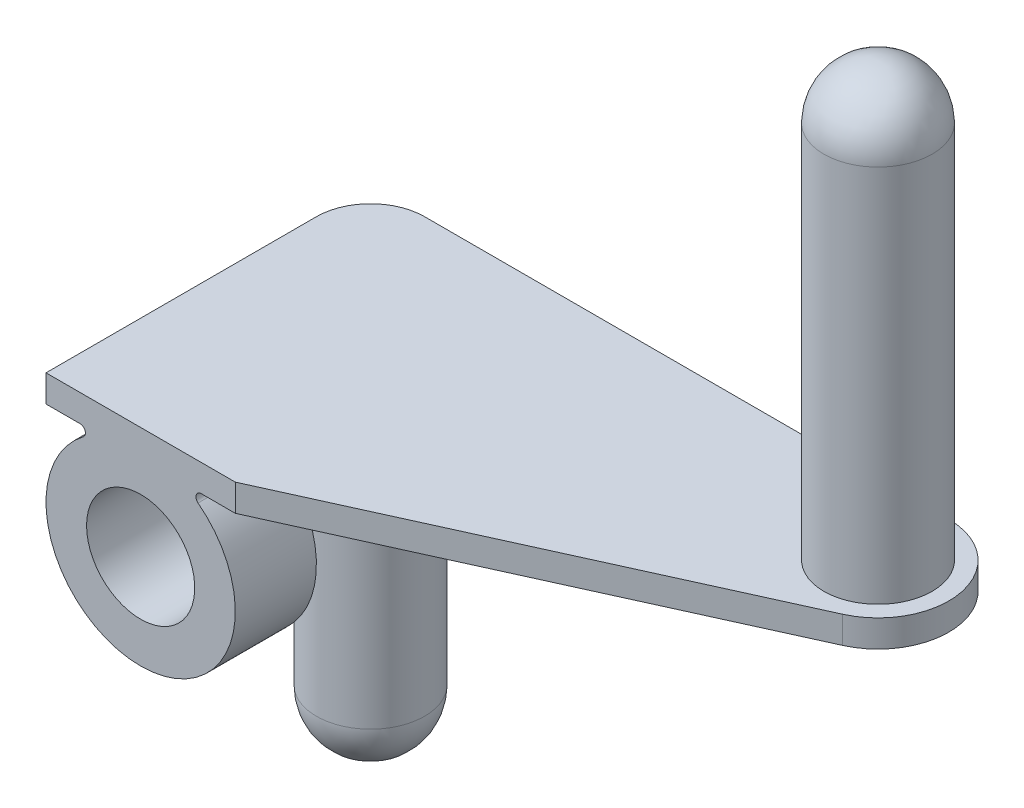
ISO-10303-21;
HEADER;
FILE_DESCRIPTION(('STEP AP214'),'2;1');
FILE_NAME('part.step','',(''),(''),'','','');
FILE_SCHEMA(('AUTOMOTIVE_DESIGN { 1 0 10303 214 1 1 1 1 }'));
ENDSEC;
DATA;
#1=APPLICATION_CONTEXT('core data for automotive mechanical design processes');
#2=APPLICATION_PROTOCOL_DEFINITION('international standard','automotive_design',2000,#1);
#3=PRODUCT_CONTEXT('',#1,'mechanical');
#4=PRODUCT('Part','Part','',(#3));
#5=PRODUCT_RELATED_PRODUCT_CATEGORY('part','',(#4));
#6=PRODUCT_DEFINITION_FORMATION('','',#4);
#7=PRODUCT_DEFINITION_CONTEXT('part definition',#1,'design');
#8=PRODUCT_DEFINITION('design','',#6,#7);
#9=PRODUCT_DEFINITION_SHAPE('','',#8);
#10=(LENGTH_UNIT() NAMED_UNIT(*) SI_UNIT(.MILLI.,.METRE.));
#11=(NAMED_UNIT(*) PLANE_ANGLE_UNIT() SI_UNIT($,.RADIAN.));
#12=(NAMED_UNIT(*) SI_UNIT($,.STERADIAN.) SOLID_ANGLE_UNIT());
#13=UNCERTAINTY_MEASURE_WITH_UNIT(LENGTH_MEASURE(1.E-05),#10,'distance_accuracy_value','');
#14=(GEOMETRIC_REPRESENTATION_CONTEXT(3) GLOBAL_UNCERTAINTY_ASSIGNED_CONTEXT((#13)) GLOBAL_UNIT_ASSIGNED_CONTEXT((#10,
#11,#12)) REPRESENTATION_CONTEXT('',''));
#15=CARTESIAN_POINT('',(0.,0.,0.));
#16=DIRECTION('',(0.,0.,1.));
#17=DIRECTION('',(1.,0.,0.));
#18=AXIS2_PLACEMENT_3D('',#15,#16,#17);
#19=CARTESIAN_POINT('',(-38.3909419454001,-16.,20.));
#20=DIRECTION('',(0.,1.,0.));
#21=DIRECTION('',(0.,0.,-1.));
#22=AXIS2_PLACEMENT_3D('',#19,#20,#21);
#23=CYLINDRICAL_SURFACE('',#22,2.);
#24=CARTESIAN_POINT('',(-38.3909419454001,-1.,20.));
#25=DIRECTION('',(0.,1.,0.));
#26=DIRECTION('',(0.,0.,1.));
#27=AXIS2_PLACEMENT_3D('',#24,#25,#26);
#28=CIRCLE('',#27,2.);
#29=CARTESIAN_POINT('',(-38.3909419454001,-1.,18.));
#30=VERTEX_POINT('',#29);
#31=CARTESIAN_POINT('',(-40.3909419454001,-1.,20.));
#32=VERTEX_POINT('',#31);
#33=EDGE_CURVE('E184',#30,#32,#28,.F.);
#34=ORIENTED_EDGE('',*,*,#33,.T.);
#35=DIRECTION('',(0.,1.,0.));
#36=VECTOR('',#35,1.);
#37=CARTESIAN_POINT('',(-40.3909419454001,-1.,20.));
#38=LINE('',#37,#36);
#39=CARTESIAN_POINT('',(-40.3909419454001,0.,20.));
#40=VERTEX_POINT('',#39);
#41=EDGE_CURVE('E249',#32,#40,#38,.T.);
#42=ORIENTED_EDGE('',*,*,#41,.T.);
#43=CARTESIAN_POINT('',(-38.3909419454001,0.,20.));
#44=DIRECTION('',(0.,-1.,0.));
#45=DIRECTION('',(0.,0.,-1.));
#46=AXIS2_PLACEMENT_3D('',#43,#44,#45);
#47=CIRCLE('',#46,2.);
#48=CARTESIAN_POINT('',(-38.3909419454001,0.,18.));
#49=VERTEX_POINT('',#48);
#50=EDGE_CURVE('E186',#40,#49,#47,.T.);
#51=ORIENTED_EDGE('',*,*,#50,.T.);
#52=DIRECTION('',(0.,1.,0.));
#53=VECTOR('',#52,1.);
#54=CARTESIAN_POINT('',(-38.3909419454001,-1.,18.));
#55=LINE('',#54,#53);
#56=EDGE_CURVE('E171',#30,#49,#55,.T.);
#57=ORIENTED_EDGE('',*,*,#56,.F.);
#58=EDGE_LOOP('',(#34,#42,#51,#57));
#59=FACE_BOUND('',#58,.T.);
#60=CARTESIAN_POINT('',(-38.3909419454001,-14.,20.));
#61=DIRECTION('',(0.,-1.,0.));
#62=DIRECTION('',(0.,0.,-1.));
#63=AXIS2_PLACEMENT_3D('',#60,#61,#62);
#64=CIRCLE('',#63,2.);
#65=CARTESIAN_POINT('',(-38.3909419454001,-14.,18.));
#66=VERTEX_POINT('',#65);
#67=EDGE_CURVE('E194',#66,#66,#64,.T.);
#68=ORIENTED_EDGE('',*,*,#67,.F.);
#69=EDGE_LOOP('',(#68));
#70=FACE_BOUND('',#69,.T.);
#71=ADVANCED_FACE('F89',(#59,#70),#23,.T.);
#72=CARTESIAN_POINT('',(-38.3909419454001,0.,20.));
#73=DIRECTION('',(0.,1.,0.));
#74=DIRECTION('',(0.,0.,-1.));
#75=AXIS2_PLACEMENT_3D('',#72,#73,#74);
#76=PLANE('',#75);
#77=CARTESIAN_POINT('',(-19.0077705365883,0.,20.6168285911882));
#78=DIRECTION('',(0.,-1.,0.));
#79=DIRECTION('',(0.,0.,-1.));
#80=AXIS2_PLACEMENT_3D('',#77,#78,#79);
#81=CIRCLE('',#80,2.);
#82=CARTESIAN_POINT('',(-19.0077705365883,0.,18.6168285911882));
#83=VERTEX_POINT('',#82);
#84=EDGE_CURVE('E240',#83,#83,#81,.T.);
#85=ORIENTED_EDGE('',*,*,#84,.T.);
#86=EDGE_LOOP('',(#85));
#87=FACE_BOUND('',#86,.T.);
#88=ORIENTED_EDGE('',*,*,#50,.F.);
#89=DIRECTION('',(0.,0.,-1.));
#90=VECTOR('',#89,1.);
#91=CARTESIAN_POINT('',(-40.3909419454001,0.,20.));
#92=LINE('',#91,#90);
#93=CARTESIAN_POINT('',(-40.3909419454001,0.,30.));
#94=VERTEX_POINT('',#93);
#95=EDGE_CURVE('E178',#94,#40,#92,.T.);
#96=ORIENTED_EDGE('',*,*,#95,.F.);
#97=DIRECTION('',(-1.,0.,0.));
#98=VECTOR('',#97,1.);
#99=CARTESIAN_POINT('',(-40.3909419454001,0.,30.));
#100=LINE('',#99,#98);
#101=CARTESIAN_POINT('',(-33.3909419454001,0.,30.));
#102=VERTEX_POINT('',#101);
#103=EDGE_CURVE('E246',#102,#94,#100,.T.);
#104=ORIENTED_EDGE('',*,*,#103,.F.);
#105=DIRECTION('',(-0.91101143688837,0.,0.412381088143707));
#106=VECTOR('',#105,1.);
#107=CARTESIAN_POINT('',(-33.3909419454001,0.,30.));
#108=LINE('',#107,#106);
#109=CARTESIAN_POINT('',(-17.9286399146686,0.,23.0007893661372));
#110=VERTEX_POINT('',#109);
#111=EDGE_CURVE('E243',#110,#102,#108,.T.);
#112=ORIENTED_EDGE('',*,*,#111,.F.);
#113=CARTESIAN_POINT('',(-19.0077705365883,0.,20.6168285911882));
#114=DIRECTION('',(0.,-1.,0.));
#115=DIRECTION('',(0.,0.,1.));
#116=AXIS2_PLACEMENT_3D('',#113,#114,#115);
#117=CIRCLE('',#116,2.61682859118822);
#118=CARTESIAN_POINT('',(-19.0077705365883,0.,18.));
#119=VERTEX_POINT('',#118);
#120=EDGE_CURVE('E239',#119,#110,#117,.T.);
#121=ORIENTED_EDGE('',*,*,#120,.F.);
#122=DIRECTION('',(1.,0.,0.));
#123=VECTOR('',#122,1.);
#124=CARTESIAN_POINT('',(-19.0077705365883,0.,18.));
#125=LINE('',#124,#123);
#126=EDGE_CURVE('E237',#49,#119,#125,.T.);
#127=ORIENTED_EDGE('',*,*,#126,.F.);
#128=EDGE_LOOP('',(#88,#96,#104,#112,#121,#127));
#129=FACE_BOUND('',#128,.T.);
#130=ADVANCED_FACE('F262',(#87,#129),#76,.T.);
#131=CARTESIAN_POINT('',(-38.3909419454001,-14.,20.));
#132=DIRECTION('',(0.,1.,0.));
#133=DIRECTION('',(0.,0.,-1.));
#134=AXIS2_PLACEMENT_3D('',#131,#132,#133);
#135=SPHERICAL_SURFACE('',#134,2.);
#136=ORIENTED_EDGE('',*,*,#67,.T.);
#137=EDGE_LOOP('',(#136));
#138=FACE_BOUND('',#137,.T.);
#139=ADVANCED_FACE('F305',(#138),#135,.T.);
#140=CARTESIAN_POINT('',(-40.3909419454001,-1.,20.));
#141=DIRECTION('',(-1.,0.,0.));
#142=DIRECTION('',(0.,0.,-1.));
#143=AXIS2_PLACEMENT_3D('',#140,#141,#142);
#144=PLANE('',#143);
#145=ORIENTED_EDGE('',*,*,#95,.T.);
#146=ORIENTED_EDGE('',*,*,#41,.F.);
#147=DIRECTION('',(0.,0.,-1.));
#148=VECTOR('',#147,1.);
#149=CARTESIAN_POINT('',(-40.3909419454001,-1.,20.));
#150=LINE('',#149,#148);
#151=CARTESIAN_POINT('',(-40.3909419454001,-1.,30.));
#152=VERTEX_POINT('',#151);
#153=EDGE_CURVE('E187',#152,#32,#150,.T.);
#154=ORIENTED_EDGE('',*,*,#153,.F.);
#155=DIRECTION('',(0.,1.,0.));
#156=VECTOR('',#155,1.);
#157=CARTESIAN_POINT('',(-40.3909419454001,-1.,30.));
#158=LINE('',#157,#156);
#159=EDGE_CURVE('E228',#152,#94,#158,.T.);
#160=ORIENTED_EDGE('',*,*,#159,.T.);
#161=EDGE_LOOP('',(#145,#146,#154,#160));
#162=FACE_BOUND('',#161,.T.);
#163=ADVANCED_FACE('F312',(#162),#144,.T.);
#164=CARTESIAN_POINT('',(-40.3909419454001,-1.,30.));
#165=DIRECTION('',(0.,0.,1.));
#166=DIRECTION('',(-1.,0.,0.));
#167=AXIS2_PLACEMENT_3D('',#164,#165,#166);
#168=PLANE('',#167);
#169=CARTESIAN_POINT('',(-36.8909419454001,-4.14203978385195,30.));
#170=DIRECTION('',(0.,0.,-1.));
#171=DIRECTION('',(-1.,0.,0.));
#172=AXIS2_PLACEMENT_3D('',#169,#170,#171);
#173=CIRCLE('',#172,2.);
#174=CARTESIAN_POINT('',(-38.8909419454001,-4.14203978385195,30.));
#175=VERTEX_POINT('',#174);
#176=EDGE_CURVE('E276',#175,#175,#173,.T.);
#177=ORIENTED_EDGE('',*,*,#176,.T.);
#178=EDGE_LOOP('',(#177));
#179=FACE_BOUND('',#178,.T.);
#180=DIRECTION('',(-1.,0.,0.));
#181=VECTOR('',#180,1.);
#182=CARTESIAN_POINT('',(-40.3909419454001,-1.,30.));
#183=LINE('',#182,#181);
#184=CARTESIAN_POINT('',(-33.3909419454001,-1.,30.));
#185=VERTEX_POINT('',#184);
#186=CARTESIAN_POINT('',(-34.6471946534279,-1.,30.));
#187=VERTEX_POINT('',#186);
#188=EDGE_CURVE('E229',#185,#187,#183,.T.);
#189=ORIENTED_EDGE('',*,*,#188,.F.);
#190=DIRECTION('',(0.,1.,0.));
#191=VECTOR('',#190,1.);
#192=CARTESIAN_POINT('',(-33.3909419454001,-1.,30.));
#193=LINE('',#192,#191);
#194=EDGE_CURVE('E252',#185,#102,#193,.T.);
#195=ORIENTED_EDGE('',*,*,#194,.T.);
#196=ORIENTED_EDGE('',*,*,#103,.T.);
#197=ORIENTED_EDGE('',*,*,#159,.F.);
#198=CARTESIAN_POINT('',(-39.1346892373723,-1.,30.));
#199=VERTEX_POINT('',#198);
#200=EDGE_CURVE('E224',#199,#152,#183,.T.);
#201=ORIENTED_EDGE('',*,*,#200,.F.);
#202=CARTESIAN_POINT('',(-39.1346892373723,-1.2,30.));
#203=DIRECTION('',(0.,0.,-1.));
#204=DIRECTION('',(-1.,0.,0.));
#205=AXIS2_PLACEMENT_3D('',#202,#203,#204);
#206=CIRCLE('',#205,0.2);
#207=CARTESIAN_POINT('',(-39.0134055999684,-1.35902917750551,30.));
#208=VERTEX_POINT('',#207);
#209=EDGE_CURVE('E98',#208,#199,#206,.F.);
#210=ORIENTED_EDGE('',*,*,#209,.F.);
#211=CARTESIAN_POINT('',(-36.8909419454001,-4.14203978385195,30.));
#212=DIRECTION('',(0.,0.,-1.));
#213=DIRECTION('',(-1.,0.,0.));
#214=AXIS2_PLACEMENT_3D('',#211,#212,#213);
#215=CIRCLE('',#214,3.5);
#216=CARTESIAN_POINT('',(-34.7684782908318,-1.35902917750551,30.));
#217=VERTEX_POINT('',#216);
#218=EDGE_CURVE('E273',#217,#208,#215,.T.);
#219=ORIENTED_EDGE('',*,*,#218,.F.);
#220=CARTESIAN_POINT('',(-34.6471946534279,-1.2,30.));
#221=DIRECTION('',(0.,0.,-1.));
#222=DIRECTION('',(-1.,0.,0.));
#223=AXIS2_PLACEMENT_3D('',#220,#221,#222);
#224=CIRCLE('',#223,0.2);
#225=EDGE_CURVE('E213',#187,#217,#224,.F.);
#226=ORIENTED_EDGE('',*,*,#225,.F.);
#227=EDGE_LOOP('',(#189,#195,#196,#197,#201,#210,#219,#226));
#228=FACE_BOUND('',#227,.T.);
#229=ADVANCED_FACE('F226',(#179,#228),#168,.T.);
#230=CARTESIAN_POINT('',(-33.3909419454001,-1.,30.));
#231=DIRECTION('',(0.412381088143707,0.,0.91101143688837));
#232=DIRECTION('',(-0.91101143688837,0.,0.412381088143707));
#233=AXIS2_PLACEMENT_3D('',#230,#231,#232);
#234=PLANE('',#233);
#235=ORIENTED_EDGE('',*,*,#111,.T.);
#236=ORIENTED_EDGE('',*,*,#194,.F.);
#237=DIRECTION('',(-0.91101143688837,0.,0.412381088143707));
#238=VECTOR('',#237,1.);
#239=CARTESIAN_POINT('',(-33.3909419454001,-1.,30.));
#240=LINE('',#239,#238);
#241=CARTESIAN_POINT('',(-17.9286399146686,-1.,23.0007893661372));
#242=VERTEX_POINT('',#241);
#243=EDGE_CURVE('E230',#242,#185,#240,.T.);
#244=ORIENTED_EDGE('',*,*,#243,.F.);
#245=DIRECTION('',(0.,1.,0.));
#246=VECTOR('',#245,1.);
#247=CARTESIAN_POINT('',(-17.9286399146686,-1.,23.0007893661372));
#248=LINE('',#247,#246);
#249=EDGE_CURVE('E254',#242,#110,#248,.T.);
#250=ORIENTED_EDGE('',*,*,#249,.T.);
#251=EDGE_LOOP('',(#235,#236,#244,#250));
#252=FACE_BOUND('',#251,.T.);
#253=ADVANCED_FACE('F267',(#252),#234,.T.);
#254=CARTESIAN_POINT('',(-19.0077705365883,-1.,20.6168285911882));
#255=DIRECTION('',(0.,1.,0.));
#256=DIRECTION('',(0.,0.,-1.));
#257=AXIS2_PLACEMENT_3D('',#254,#255,#256);
#258=CYLINDRICAL_SURFACE('',#257,2.61682859118822);
#259=ORIENTED_EDGE('',*,*,#120,.T.);
#260=ORIENTED_EDGE('',*,*,#249,.F.);
#261=CARTESIAN_POINT('',(-19.0077705365883,-1.,20.6168285911882));
#262=DIRECTION('',(0.,-1.,0.));
#263=DIRECTION('',(0.,0.,1.));
#264=AXIS2_PLACEMENT_3D('',#261,#262,#263);
#265=CIRCLE('',#264,2.61682859118822);
#266=CARTESIAN_POINT('',(-19.0077705365883,-1.,18.));
#267=VERTEX_POINT('',#266);
#268=EDGE_CURVE('E177',#267,#242,#265,.T.);
#269=ORIENTED_EDGE('',*,*,#268,.F.);
#270=DIRECTION('',(0.,1.,0.));
#271=VECTOR('',#270,1.);
#272=CARTESIAN_POINT('',(-19.0077705365883,-1.,18.));
#273=LINE('',#272,#271);
#274=EDGE_CURVE('E173',#267,#119,#273,.T.);
#275=ORIENTED_EDGE('',*,*,#274,.T.);
#276=EDGE_LOOP('',(#259,#260,#269,#275));
#277=FACE_BOUND('',#276,.T.);
#278=ADVANCED_FACE('F257',(#277),#258,.T.);
#279=CARTESIAN_POINT('',(-19.0077705365883,-1.,18.));
#280=DIRECTION('',(0.,0.,-1.));
#281=DIRECTION('',(1.,0.,0.));
#282=AXIS2_PLACEMENT_3D('',#279,#280,#281);
#283=PLANE('',#282);
#284=ORIENTED_EDGE('',*,*,#126,.T.);
#285=ORIENTED_EDGE('',*,*,#274,.F.);
#286=DIRECTION('',(1.,0.,0.));
#287=VECTOR('',#286,1.);
#288=CARTESIAN_POINT('',(-19.0077705365883,-1.,18.));
#289=LINE('',#288,#287);
#290=EDGE_CURVE('E167',#30,#267,#289,.T.);
#291=ORIENTED_EDGE('',*,*,#290,.F.);
#292=ORIENTED_EDGE('',*,*,#56,.T.);
#293=EDGE_LOOP('',(#284,#285,#291,#292));
#294=FACE_BOUND('',#293,.T.);
#295=ADVANCED_FACE('F170',(#294),#283,.T.);
#296=CARTESIAN_POINT('',(-38.3909419454001,-1.,20.));
#297=DIRECTION('',(0.,-1.,0.));
#298=DIRECTION('',(0.,0.,1.));
#299=AXIS2_PLACEMENT_3D('',#296,#297,#298);
#300=PLANE('',#299);
#301=DIRECTION('',(1.,0.,0.));
#302=VECTOR('',#301,1.);
#303=CARTESIAN_POINT('',(-38.3909419454001,-1.,27.));
#304=LINE('',#303,#302);
#305=CARTESIAN_POINT('',(-39.1346892373723,-1.,27.));
#306=VERTEX_POINT('',#305);
#307=CARTESIAN_POINT('',(-34.6471946534279,-1.,27.));
#308=VERTEX_POINT('',#307);
#309=EDGE_CURVE('E197',#306,#308,#304,.T.);
#310=ORIENTED_EDGE('',*,*,#309,.F.);
#311=DIRECTION('',(0.,0.,-1.));
#312=VECTOR('',#311,1.);
#313=CARTESIAN_POINT('',(-39.1346892373723,-1.,27.));
#314=LINE('',#313,#312);
#315=EDGE_CURVE('E208',#199,#306,#314,.T.);
#316=ORIENTED_EDGE('',*,*,#315,.F.);
#317=ORIENTED_EDGE('',*,*,#200,.T.);
#318=ORIENTED_EDGE('',*,*,#153,.T.);
#319=ORIENTED_EDGE('',*,*,#33,.F.);
#320=ORIENTED_EDGE('',*,*,#290,.T.);
#321=ORIENTED_EDGE('',*,*,#268,.T.);
#322=ORIENTED_EDGE('',*,*,#243,.T.);
#323=ORIENTED_EDGE('',*,*,#188,.T.);
#324=DIRECTION('',(0.,0.,-1.));
#325=VECTOR('',#324,1.);
#326=CARTESIAN_POINT('',(-34.6471946534279,-1.,30.));
#327=LINE('',#326,#325);
#328=EDGE_CURVE('E210',#308,#187,#327,.F.);
#329=ORIENTED_EDGE('',*,*,#328,.F.);
#330=EDGE_LOOP('',(#310,#316,#317,#318,#319,#320,#321,#322,#323,#329));
#331=FACE_BOUND('',#330,.T.);
#332=ADVANCED_FACE('F190',(#331),#300,.T.);
#333=CARTESIAN_POINT('',(-19.0077705365883,16.,20.6168285911882));
#334=DIRECTION('',(0.,-1.,0.));
#335=DIRECTION('',(0.,0.,1.));
#336=AXIS2_PLACEMENT_3D('',#333,#334,#335);
#337=CYLINDRICAL_SURFACE('',#336,2.);
#338=CARTESIAN_POINT('',(-19.0077705365883,14.,20.6168285911882));
#339=DIRECTION('',(0.,1.,0.));
#340=DIRECTION('',(0.,0.,1.));
#341=AXIS2_PLACEMENT_3D('',#338,#339,#340);
#342=CIRCLE('',#341,2.);
#343=CARTESIAN_POINT('',(-19.0077705365883,14.,22.6168285911882));
#344=VERTEX_POINT('',#343);
#345=EDGE_CURVE('E193',#344,#344,#342,.T.);
#346=ORIENTED_EDGE('',*,*,#345,.F.);
#347=EDGE_LOOP('',(#346));
#348=FACE_BOUND('',#347,.T.);
#349=ORIENTED_EDGE('',*,*,#84,.F.);
#350=EDGE_LOOP('',(#349));
#351=FACE_BOUND('',#350,.T.);
#352=ADVANCED_FACE('F315',(#348,#351),#337,.T.);
#353=CARTESIAN_POINT('',(-19.0077705365883,14.,20.6168285911882));
#354=DIRECTION('',(0.,1.,0.));
#355=DIRECTION('',(0.,0.,-1.));
#356=AXIS2_PLACEMENT_3D('',#353,#354,#355);
#357=SPHERICAL_SURFACE('',#356,2.);
#358=ORIENTED_EDGE('',*,*,#345,.T.);
#359=EDGE_LOOP('',(#358));
#360=FACE_BOUND('',#359,.T.);
#361=ADVANCED_FACE('F288',(#360),#357,.T.);
#362=CARTESIAN_POINT('',(-36.8909419454001,-4.14203978385195,27.));
#363=DIRECTION('',(0.,0.,1.));
#364=DIRECTION('',(-1.,0.,0.));
#365=AXIS2_PLACEMENT_3D('',#362,#363,#364);
#366=PLANE('',#365);
#367=CARTESIAN_POINT('',(-36.8909419454001,-4.14203978385195,27.));
#368=DIRECTION('',(0.,0.,-1.));
#369=DIRECTION('',(-1.,0.,0.));
#370=AXIS2_PLACEMENT_3D('',#367,#368,#369);
#371=CIRCLE('',#370,2.);
#372=CARTESIAN_POINT('',(-38.8909419454001,-4.14203978385195,27.));
#373=VERTEX_POINT('',#372);
#374=EDGE_CURVE('E93',#373,#373,#371,.T.);
#375=ORIENTED_EDGE('',*,*,#374,.F.);
#376=EDGE_LOOP('',(#375));
#377=FACE_BOUND('',#376,.T.);
#378=ORIENTED_EDGE('',*,*,#309,.T.);
#379=CARTESIAN_POINT('',(-34.6471946534279,-1.2,27.));
#380=DIRECTION('',(0.,0.,-1.));
#381=DIRECTION('',(-1.,0.,0.));
#382=AXIS2_PLACEMENT_3D('',#379,#380,#381);
#383=CIRCLE('',#382,0.2);
#384=CARTESIAN_POINT('',(-34.7684782908318,-1.35902917750551,27.));
#385=VERTEX_POINT('',#384);
#386=EDGE_CURVE('E105',#385,#308,#383,.T.);
#387=ORIENTED_EDGE('',*,*,#386,.F.);
#388=CARTESIAN_POINT('',(-36.8909419454001,-4.14203978385195,27.));
#389=DIRECTION('',(0.,0.,-1.));
#390=DIRECTION('',(-1.,0.,0.));
#391=AXIS2_PLACEMENT_3D('',#388,#389,#390);
#392=CIRCLE('',#391,3.5);
#393=CARTESIAN_POINT('',(-39.0134055999684,-1.35902917750551,27.));
#394=VERTEX_POINT('',#393);
#395=EDGE_CURVE('E272',#385,#394,#392,.T.);
#396=ORIENTED_EDGE('',*,*,#395,.T.);
#397=CARTESIAN_POINT('',(-39.1346892373723,-1.2,27.));
#398=DIRECTION('',(0.,0.,-1.));
#399=DIRECTION('',(-1.,0.,0.));
#400=AXIS2_PLACEMENT_3D('',#397,#398,#399);
#401=CIRCLE('',#400,0.2);
#402=EDGE_CURVE('E12',#306,#394,#401,.T.);
#403=ORIENTED_EDGE('',*,*,#402,.F.);
#404=EDGE_LOOP('',(#378,#387,#396,#403));
#405=FACE_BOUND('',#404,.T.);
#406=ADVANCED_FACE('F285',(#377,#405),#366,.F.);
#407=CARTESIAN_POINT('',(-36.8909419454001,-4.14203978385195,27.));
#408=DIRECTION('',(0.,0.,1.));
#409=DIRECTION('',(-1.,0.,0.));
#410=AXIS2_PLACEMENT_3D('',#407,#408,#409);
#411=CYLINDRICAL_SURFACE('',#410,3.5);
#412=ORIENTED_EDGE('',*,*,#218,.T.);
#413=DIRECTION('',(0.,0.,1.));
#414=VECTOR('',#413,1.);
#415=CARTESIAN_POINT('',(-39.0134055999684,-1.35902917750551,27.));
#416=LINE('',#415,#414);
#417=EDGE_CURVE('E204',#394,#208,#416,.T.);
#418=ORIENTED_EDGE('',*,*,#417,.F.);
#419=ORIENTED_EDGE('',*,*,#395,.F.);
#420=DIRECTION('',(0.,0.,1.));
#421=VECTOR('',#420,1.);
#422=CARTESIAN_POINT('',(-34.7684782908318,-1.35902917750551,27.));
#423=LINE('',#422,#421);
#424=EDGE_CURVE('E206',#217,#385,#423,.F.);
#425=ORIENTED_EDGE('',*,*,#424,.F.);
#426=EDGE_LOOP('',(#412,#418,#419,#425));
#427=FACE_BOUND('',#426,.T.);
#428=ADVANCED_FACE('F287',(#427),#411,.T.);
#429=CARTESIAN_POINT('',(-34.6471946534279,-1.2,27.));
#430=DIRECTION('',(0.,0.,1.));
#431=DIRECTION('',(-1.,0.,0.));
#432=AXIS2_PLACEMENT_3D('',#429,#430,#431);
#433=CYLINDRICAL_SURFACE('',#432,0.2);
#434=ORIENTED_EDGE('',*,*,#225,.T.);
#435=ORIENTED_EDGE('',*,*,#424,.T.);
#436=ORIENTED_EDGE('',*,*,#386,.T.);
#437=ORIENTED_EDGE('',*,*,#328,.T.);
#438=EDGE_LOOP('',(#434,#435,#436,#437));
#439=FACE_BOUND('',#438,.T.);
#440=ADVANCED_FACE('F291',(#439),#433,.F.);
#441=CARTESIAN_POINT('',(-39.1346892373723,-1.2,27.));
#442=DIRECTION('',(0.,0.,1.));
#443=DIRECTION('',(-1.,0.,0.));
#444=AXIS2_PLACEMENT_3D('',#441,#442,#443);
#445=CYLINDRICAL_SURFACE('',#444,0.2);
#446=ORIENTED_EDGE('',*,*,#402,.T.);
#447=ORIENTED_EDGE('',*,*,#417,.T.);
#448=ORIENTED_EDGE('',*,*,#209,.T.);
#449=ORIENTED_EDGE('',*,*,#315,.T.);
#450=EDGE_LOOP('',(#446,#447,#448,#449));
#451=FACE_BOUND('',#450,.T.);
#452=ADVANCED_FACE('F91',(#451),#445,.F.);
#453=CARTESIAN_POINT('',(-36.8909419454001,-4.14203978385195,24.));
#454=DIRECTION('',(0.,0.,1.));
#455=DIRECTION('',(-1.,0.,0.));
#456=AXIS2_PLACEMENT_3D('',#453,#454,#455);
#457=CYLINDRICAL_SURFACE('',#456,2.);
#458=ORIENTED_EDGE('',*,*,#176,.F.);
#459=EDGE_LOOP('',(#458));
#460=FACE_BOUND('',#459,.T.);
#461=ORIENTED_EDGE('',*,*,#374,.T.);
#462=EDGE_LOOP('',(#461));
#463=FACE_BOUND('',#462,.T.);
#464=ADVANCED_FACE('F283',(#460,#463),#457,.F.);
#465=CLOSED_SHELL('',(#71,#130,#139,#163,#229,#253,#278,#295,#332,#352,#361,#406,#428,#440,#452,#464));
#466=MANIFOLD_SOLID_BREP('B2',#465);
#467=ADVANCED_BREP_SHAPE_REPRESENTATION('',(#18,#466),#14);
#468=SHAPE_DEFINITION_REPRESENTATION(#9,#467);
ENDSEC;
END-ISO-10303-21;
